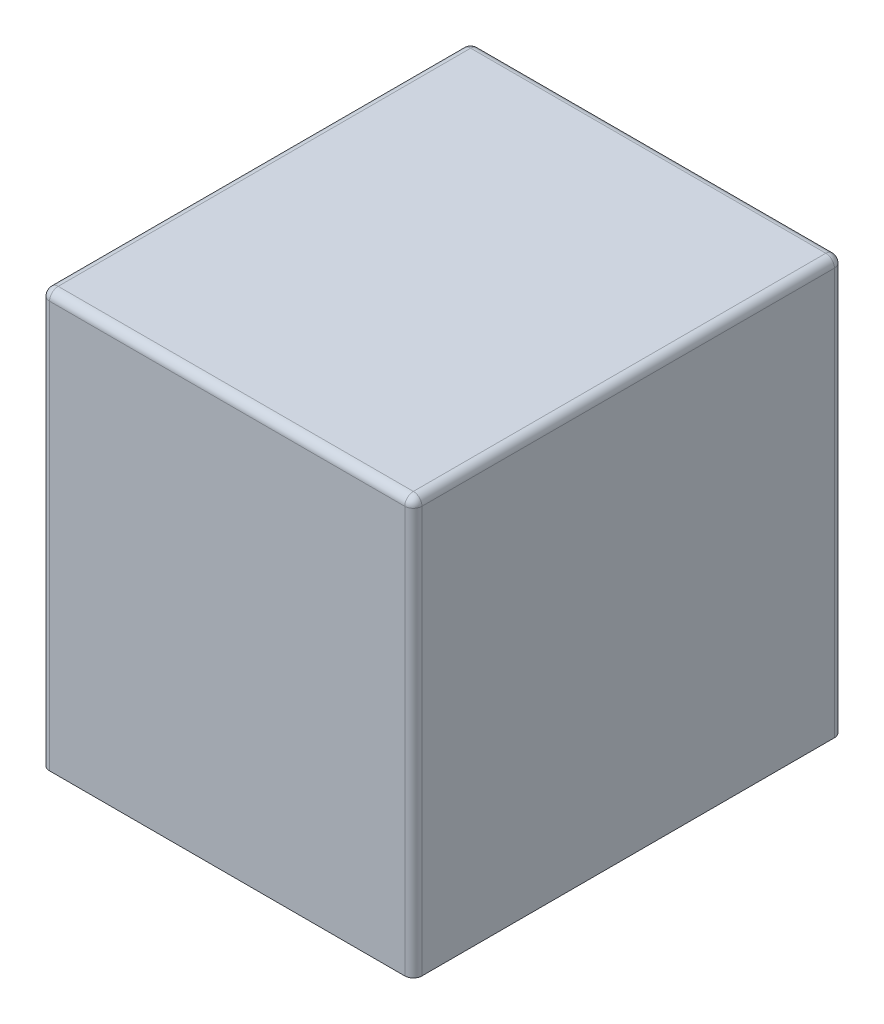
ISO-10303-21;
HEADER;
FILE_DESCRIPTION(('STEP AP214'),'2;1');
FILE_NAME('part.step','',(''),(''),'','','');
FILE_SCHEMA(('AUTOMOTIVE_DESIGN { 1 0 10303 214 1 1 1 1 }'));
ENDSEC;
DATA;
#1=APPLICATION_CONTEXT('core data for automotive mechanical design processes');
#2=APPLICATION_PROTOCOL_DEFINITION('international standard','automotive_design',2000,#1);
#3=PRODUCT_CONTEXT('',#1,'mechanical');
#4=PRODUCT('Part','Part','',(#3));
#5=PRODUCT_RELATED_PRODUCT_CATEGORY('part','',(#4));
#6=PRODUCT_DEFINITION_FORMATION('','',#4);
#7=PRODUCT_DEFINITION_CONTEXT('part definition',#1,'design');
#8=PRODUCT_DEFINITION('design','',#6,#7);
#9=PRODUCT_DEFINITION_SHAPE('','',#8);
#10=(LENGTH_UNIT() NAMED_UNIT(*) SI_UNIT(.MILLI.,.METRE.));
#11=(NAMED_UNIT(*) PLANE_ANGLE_UNIT() SI_UNIT($,.RADIAN.));
#12=(NAMED_UNIT(*) SI_UNIT($,.STERADIAN.) SOLID_ANGLE_UNIT());
#13=UNCERTAINTY_MEASURE_WITH_UNIT(LENGTH_MEASURE(1.E-05),#10,'distance_accuracy_value','');
#14=(GEOMETRIC_REPRESENTATION_CONTEXT(3) GLOBAL_UNCERTAINTY_ASSIGNED_CONTEXT((#13)) GLOBAL_UNIT_ASSIGNED_CONTEXT((#10,
#11,#12)) REPRESENTATION_CONTEXT('',''));
#15=CARTESIAN_POINT('',(0.,0.,0.));
#16=DIRECTION('',(0.,0.,1.));
#17=DIRECTION('',(1.,0.,0.));
#18=AXIS2_PLACEMENT_3D('',#15,#16,#17);
#19=CARTESIAN_POINT('',(0.,0.,0.));
#20=DIRECTION('',(0.,1.,0.));
#21=DIRECTION('',(0.,0.,1.));
#22=AXIS2_PLACEMENT_3D('',#19,#20,#21);
#23=PLANE('',#22);
#24=CARTESIAN_POINT('',(-62.5,0.,-72.5));
#25=DIRECTION('',(0.,-1.,0.));
#26=DIRECTION('',(0.,0.,-1.));
#27=AXIS2_PLACEMENT_3D('',#24,#25,#26);
#28=CIRCLE('',#27,1.45);
#29=CARTESIAN_POINT('',(-62.5,0.,-73.95));
#30=VERTEX_POINT('',#29);
#31=EDGE_CURVE('E248',#30,#30,#28,.T.);
#32=ORIENTED_EDGE('',*,*,#31,.F.);
#33=EDGE_LOOP('',(#32));
#34=FACE_BOUND('',#33,.T.);
#35=CARTESIAN_POINT('',(-62.5,0.,0.));
#36=DIRECTION('',(0.,-1.,0.));
#37=DIRECTION('',(0.,0.,-1.));
#38=AXIS2_PLACEMENT_3D('',#35,#36,#37);
#39=CIRCLE('',#38,1.45);
#40=CARTESIAN_POINT('',(-62.5,0.,-1.45000000000001));
#41=VERTEX_POINT('',#40);
#42=EDGE_CURVE('E256',#41,#41,#39,.T.);
#43=ORIENTED_EDGE('',*,*,#42,.F.);
#44=EDGE_LOOP('',(#43));
#45=FACE_BOUND('',#44,.T.);
#46=CARTESIAN_POINT('',(-62.5,0.,72.5));
#47=DIRECTION('',(0.,-1.,0.));
#48=DIRECTION('',(0.,0.,-1.));
#49=AXIS2_PLACEMENT_3D('',#46,#47,#48);
#50=CIRCLE('',#49,1.45);
#51=CARTESIAN_POINT('',(-62.5,0.,71.05));
#52=VERTEX_POINT('',#51);
#53=EDGE_CURVE('E718',#52,#52,#50,.T.);
#54=ORIENTED_EDGE('',*,*,#53,.F.);
#55=EDGE_LOOP('',(#54));
#56=FACE_BOUND('',#55,.T.);
#57=CARTESIAN_POINT('',(0.,0.,72.5));
#58=DIRECTION('',(0.,-1.,0.));
#59=DIRECTION('',(0.,0.,-1.));
#60=AXIS2_PLACEMENT_3D('',#57,#58,#59);
#61=CIRCLE('',#60,1.45);
#62=CARTESIAN_POINT('',(0.,0.,71.05));
#63=VERTEX_POINT('',#62);
#64=EDGE_CURVE('E727',#63,#63,#61,.T.);
#65=ORIENTED_EDGE('',*,*,#64,.F.);
#66=EDGE_LOOP('',(#65));
#67=FACE_BOUND('',#66,.T.);
#68=CARTESIAN_POINT('',(62.5,0.,72.5));
#69=DIRECTION('',(0.,-1.,0.));
#70=DIRECTION('',(0.,0.,-1.));
#71=AXIS2_PLACEMENT_3D('',#68,#69,#70);
#72=CIRCLE('',#71,1.45);
#73=CARTESIAN_POINT('',(62.5,0.,71.05));
#74=VERTEX_POINT('',#73);
#75=EDGE_CURVE('E733',#74,#74,#72,.T.);
#76=ORIENTED_EDGE('',*,*,#75,.F.);
#77=EDGE_LOOP('',(#76));
#78=FACE_BOUND('',#77,.T.);
#79=CARTESIAN_POINT('',(62.5,0.,0.));
#80=DIRECTION('',(0.,-1.,0.));
#81=DIRECTION('',(0.,0.,-1.));
#82=AXIS2_PLACEMENT_3D('',#79,#80,#81);
#83=CIRCLE('',#82,1.45);
#84=CARTESIAN_POINT('',(62.5,0.,-1.45000000000001));
#85=VERTEX_POINT('',#84);
#86=EDGE_CURVE('E739',#85,#85,#83,.T.);
#87=ORIENTED_EDGE('',*,*,#86,.F.);
#88=EDGE_LOOP('',(#87));
#89=FACE_BOUND('',#88,.T.);
#90=CARTESIAN_POINT('',(62.5,0.,-72.5));
#91=DIRECTION('',(0.,-1.,0.));
#92=DIRECTION('',(0.,0.,-1.));
#93=AXIS2_PLACEMENT_3D('',#90,#91,#92);
#94=CIRCLE('',#93,1.45);
#95=CARTESIAN_POINT('',(62.5,0.,-73.95));
#96=VERTEX_POINT('',#95);
#97=EDGE_CURVE('E745',#96,#96,#94,.T.);
#98=ORIENTED_EDGE('',*,*,#97,.F.);
#99=EDGE_LOOP('',(#98));
#100=FACE_BOUND('',#99,.T.);
#101=CARTESIAN_POINT('',(0.,0.,-72.5));
#102=DIRECTION('',(0.,-1.,0.));
#103=DIRECTION('',(0.,0.,-1.));
#104=AXIS2_PLACEMENT_3D('',#101,#102,#103);
#105=CIRCLE('',#104,1.45);
#106=CARTESIAN_POINT('',(0.,0.,-73.95));
#107=VERTEX_POINT('',#106);
#108=EDGE_CURVE('E264',#107,#107,#105,.T.);
#109=ORIENTED_EDGE('',*,*,#108,.F.);
#110=EDGE_LOOP('',(#109));
#111=FACE_BOUND('',#110,.T.);
#112=DIRECTION('',(0.,0.,1.));
#113=VECTOR('',#112,1.);
#114=CARTESIAN_POINT('',(-65.,0.,-75.));
#115=LINE('',#114,#113);
#116=CARTESIAN_POINT('',(-65.,0.,-72.));
#117=VERTEX_POINT('',#116);
#118=CARTESIAN_POINT('',(-65.,0.,72.));
#119=VERTEX_POINT('',#118);
#120=EDGE_CURVE('E162',#117,#119,#115,.T.);
#121=ORIENTED_EDGE('',*,*,#120,.F.);
#122=CARTESIAN_POINT('',(-62.,0.,-72.));
#123=DIRECTION('',(0.,1.,0.));
#124=DIRECTION('',(0.,0.,1.));
#125=AXIS2_PLACEMENT_3D('',#122,#123,#124);
#126=CIRCLE('',#125,3.);
#127=CARTESIAN_POINT('',(-62.,0.,-75.));
#128=VERTEX_POINT('',#127);
#129=EDGE_CURVE('E11',#117,#128,#126,.F.);
#130=ORIENTED_EDGE('',*,*,#129,.T.);
#131=DIRECTION('',(-1.,0.,0.));
#132=VECTOR('',#131,1.);
#133=CARTESIAN_POINT('',(-65.,0.,-75.));
#134=LINE('',#133,#132);
#135=CARTESIAN_POINT('',(62.,0.,-75.));
#136=VERTEX_POINT('',#135);
#137=EDGE_CURVE('E176',#136,#128,#134,.T.);
#138=ORIENTED_EDGE('',*,*,#137,.F.);
#139=CARTESIAN_POINT('',(62.,0.,-72.));
#140=DIRECTION('',(0.,1.,0.));
#141=DIRECTION('',(0.,0.,1.));
#142=AXIS2_PLACEMENT_3D('',#139,#140,#141);
#143=CIRCLE('',#142,3.);
#144=CARTESIAN_POINT('',(65.,0.,-72.));
#145=VERTEX_POINT('',#144);
#146=EDGE_CURVE('E210',#136,#145,#143,.F.);
#147=ORIENTED_EDGE('',*,*,#146,.T.);
#148=DIRECTION('',(0.,0.,-1.));
#149=VECTOR('',#148,1.);
#150=CARTESIAN_POINT('',(65.,0.,-75.));
#151=LINE('',#150,#149);
#152=CARTESIAN_POINT('',(65.,0.,72.));
#153=VERTEX_POINT('',#152);
#154=EDGE_CURVE('E173',#153,#145,#151,.T.);
#155=ORIENTED_EDGE('',*,*,#154,.F.);
#156=CARTESIAN_POINT('',(62.,0.,72.));
#157=DIRECTION('',(0.,1.,0.));
#158=DIRECTION('',(0.,0.,1.));
#159=AXIS2_PLACEMENT_3D('',#156,#157,#158);
#160=CIRCLE('',#159,3.);
#161=CARTESIAN_POINT('',(62.,0.,75.));
#162=VERTEX_POINT('',#161);
#163=EDGE_CURVE('E212',#153,#162,#160,.F.);
#164=ORIENTED_EDGE('',*,*,#163,.T.);
#165=DIRECTION('',(1.,0.,0.));
#166=VECTOR('',#165,1.);
#167=CARTESIAN_POINT('',(-65.,0.,75.));
#168=LINE('',#167,#166);
#169=CARTESIAN_POINT('',(-62.,0.,75.));
#170=VERTEX_POINT('',#169);
#171=EDGE_CURVE('E170',#170,#162,#168,.T.);
#172=ORIENTED_EDGE('',*,*,#171,.F.);
#173=CARTESIAN_POINT('',(-62.,0.,72.));
#174=DIRECTION('',(0.,1.,0.));
#175=DIRECTION('',(0.,0.,1.));
#176=AXIS2_PLACEMENT_3D('',#173,#174,#175);
#177=CIRCLE('',#176,3.);
#178=EDGE_CURVE('E44',#170,#119,#177,.F.);
#179=ORIENTED_EDGE('',*,*,#178,.T.);
#180=EDGE_LOOP('',(#121,#130,#138,#147,#155,#164,#172,#179));
#181=FACE_BOUND('',#180,.T.);
#182=DIRECTION('',(0.,0.,-1.));
#183=VECTOR('',#182,1.);
#184=CARTESIAN_POINT('',(60.,0.,-70.));
#185=LINE('',#184,#183);
#186=CARTESIAN_POINT('',(60.,0.,70.));
#187=VERTEX_POINT('',#186);
#188=CARTESIAN_POINT('',(60.,0.,-70.));
#189=VERTEX_POINT('',#188);
#190=EDGE_CURVE('E263',#187,#189,#185,.T.);
#191=ORIENTED_EDGE('',*,*,#190,.T.);
#192=DIRECTION('',(-1.,0.,0.));
#193=VECTOR('',#192,1.);
#194=CARTESIAN_POINT('',(-60.,0.,-70.));
#195=LINE('',#194,#193);
#196=CARTESIAN_POINT('',(-60.,0.,-70.));
#197=VERTEX_POINT('',#196);
#198=EDGE_CURVE('E273',#189,#197,#195,.T.);
#199=ORIENTED_EDGE('',*,*,#198,.T.);
#200=DIRECTION('',(0.,0.,1.));
#201=VECTOR('',#200,1.);
#202=CARTESIAN_POINT('',(-60.,0.,-70.));
#203=LINE('',#202,#201);
#204=CARTESIAN_POINT('',(-60.,0.,70.));
#205=VERTEX_POINT('',#204);
#206=EDGE_CURVE('E158',#197,#205,#203,.T.);
#207=ORIENTED_EDGE('',*,*,#206,.T.);
#208=DIRECTION('',(1.,0.,0.));
#209=VECTOR('',#208,1.);
#210=CARTESIAN_POINT('',(-60.,0.,70.));
#211=LINE('',#210,#209);
#212=EDGE_CURVE('E268',#205,#187,#211,.T.);
#213=ORIENTED_EDGE('',*,*,#212,.T.);
#214=EDGE_LOOP('',(#191,#199,#207,#213));
#215=FACE_BOUND('',#214,.T.);
#216=ADVANCED_FACE('F35',(#34,#45,#56,#67,#78,#89,#100,#111,#181,#215),#23,.F.);
#217=CARTESIAN_POINT('',(-65.,140.,-75.));
#218=DIRECTION('',(1.,0.,0.));
#219=DIRECTION('',(0.,0.,-1.));
#220=AXIS2_PLACEMENT_3D('',#217,#218,#219);
#221=PLANE('',#220);
#222=DIRECTION('',(0.,0.,1.));
#223=VECTOR('',#222,1.);
#224=CARTESIAN_POINT('',(-65.,142.,-75.));
#225=LINE('',#224,#223);
#226=CARTESIAN_POINT('',(-65.,142.,72.));
#227=VERTEX_POINT('',#226);
#228=CARTESIAN_POINT('',(-65.,142.,-72.));
#229=VERTEX_POINT('',#228);
#230=EDGE_CURVE('E202',#227,#229,#225,.F.);
#231=ORIENTED_EDGE('',*,*,#230,.T.);
#232=DIRECTION('',(0.,-1.,0.));
#233=VECTOR('',#232,1.);
#234=CARTESIAN_POINT('',(-65.,140.,-72.));
#235=LINE('',#234,#233);
#236=EDGE_CURVE('E204',#229,#117,#235,.T.);
#237=ORIENTED_EDGE('',*,*,#236,.T.);
#238=ORIENTED_EDGE('',*,*,#120,.T.);
#239=DIRECTION('',(0.,-1.,0.));
#240=VECTOR('',#239,1.);
#241=CARTESIAN_POINT('',(-65.,140.,72.));
#242=LINE('',#241,#240);
#243=EDGE_CURVE('E200',#119,#227,#242,.F.);
#244=ORIENTED_EDGE('',*,*,#243,.T.);
#245=EDGE_LOOP('',(#231,#237,#238,#244));
#246=FACE_BOUND('',#245,.T.);
#247=ADVANCED_FACE('F297',(#246),#221,.F.);
#248=CARTESIAN_POINT('',(-65.,140.,75.));
#249=DIRECTION('',(0.,0.,-1.));
#250=DIRECTION('',(-1.,0.,0.));
#251=AXIS2_PLACEMENT_3D('',#248,#249,#250);
#252=PLANE('',#251);
#253=DIRECTION('',(1.,0.,0.));
#254=VECTOR('',#253,1.);
#255=CARTESIAN_POINT('',(-65.,142.,75.));
#256=LINE('',#255,#254);
#257=CARTESIAN_POINT('',(62.,142.,75.));
#258=VERTEX_POINT('',#257);
#259=CARTESIAN_POINT('',(-62.,142.,75.));
#260=VERTEX_POINT('',#259);
#261=EDGE_CURVE('E196',#258,#260,#256,.F.);
#262=ORIENTED_EDGE('',*,*,#261,.T.);
#263=DIRECTION('',(0.,-1.,0.));
#264=VECTOR('',#263,1.);
#265=CARTESIAN_POINT('',(-62.,140.,75.));
#266=LINE('',#265,#264);
#267=EDGE_CURVE('E198',#260,#170,#266,.T.);
#268=ORIENTED_EDGE('',*,*,#267,.T.);
#269=ORIENTED_EDGE('',*,*,#171,.T.);
#270=DIRECTION('',(0.,-1.,0.));
#271=VECTOR('',#270,1.);
#272=CARTESIAN_POINT('',(62.,140.,75.));
#273=LINE('',#272,#271);
#274=EDGE_CURVE('E194',#162,#258,#273,.F.);
#275=ORIENTED_EDGE('',*,*,#274,.T.);
#276=EDGE_LOOP('',(#262,#268,#269,#275));
#277=FACE_BOUND('',#276,.T.);
#278=ADVANCED_FACE('F302',(#277),#252,.F.);
#279=CARTESIAN_POINT('',(65.,140.,-75.));
#280=DIRECTION('',(-1.,0.,0.));
#281=DIRECTION('',(0.,0.,1.));
#282=AXIS2_PLACEMENT_3D('',#279,#280,#281);
#283=PLANE('',#282);
#284=DIRECTION('',(0.,0.,-1.));
#285=VECTOR('',#284,1.);
#286=CARTESIAN_POINT('',(65.,142.,75.));
#287=LINE('',#286,#285);
#288=CARTESIAN_POINT('',(65.,142.,-72.));
#289=VERTEX_POINT('',#288);
#290=CARTESIAN_POINT('',(65.,142.,72.));
#291=VERTEX_POINT('',#290);
#292=EDGE_CURVE('E189',#289,#291,#287,.F.);
#293=ORIENTED_EDGE('',*,*,#292,.T.);
#294=DIRECTION('',(0.,-1.,0.));
#295=VECTOR('',#294,1.);
#296=CARTESIAN_POINT('',(65.,140.,72.));
#297=LINE('',#296,#295);
#298=EDGE_CURVE('E192',#291,#153,#297,.T.);
#299=ORIENTED_EDGE('',*,*,#298,.T.);
#300=ORIENTED_EDGE('',*,*,#154,.T.);
#301=DIRECTION('',(0.,-1.,0.));
#302=VECTOR('',#301,1.);
#303=CARTESIAN_POINT('',(65.,140.,-72.));
#304=LINE('',#303,#302);
#305=EDGE_CURVE('E187',#145,#289,#304,.F.);
#306=ORIENTED_EDGE('',*,*,#305,.T.);
#307=EDGE_LOOP('',(#293,#299,#300,#306));
#308=FACE_BOUND('',#307,.T.);
#309=ADVANCED_FACE('F293',(#308),#283,.F.);
#310=CARTESIAN_POINT('',(-65.,140.,-75.));
#311=DIRECTION('',(0.,0.,1.));
#312=DIRECTION('',(1.,0.,0.));
#313=AXIS2_PLACEMENT_3D('',#310,#311,#312);
#314=PLANE('',#313);
#315=ORIENTED_EDGE('',*,*,#137,.T.);
#316=DIRECTION('',(0.,-1.,0.));
#317=VECTOR('',#316,1.);
#318=CARTESIAN_POINT('',(-62.,140.,-75.));
#319=LINE('',#318,#317);
#320=CARTESIAN_POINT('',(-62.,142.,-75.));
#321=VERTEX_POINT('',#320);
#322=EDGE_CURVE('E52',#128,#321,#319,.F.);
#323=ORIENTED_EDGE('',*,*,#322,.T.);
#324=DIRECTION('',(-1.,0.,0.));
#325=VECTOR('',#324,1.);
#326=CARTESIAN_POINT('',(65.,142.,-75.));
#327=LINE('',#326,#325);
#328=CARTESIAN_POINT('',(62.,142.,-75.));
#329=VERTEX_POINT('',#328);
#330=EDGE_CURVE('E57',#321,#329,#327,.F.);
#331=ORIENTED_EDGE('',*,*,#330,.T.);
#332=DIRECTION('',(0.,-1.,0.));
#333=VECTOR('',#332,1.);
#334=CARTESIAN_POINT('',(62.,140.,-75.));
#335=LINE('',#334,#333);
#336=EDGE_CURVE('E206',#329,#136,#335,.T.);
#337=ORIENTED_EDGE('',*,*,#336,.T.);
#338=EDGE_LOOP('',(#315,#323,#331,#337));
#339=FACE_BOUND('',#338,.T.);
#340=ADVANCED_FACE('F286',(#339),#314,.F.);
#341=CARTESIAN_POINT('',(60.,140.,-70.));
#342=DIRECTION('',(-1.,0.,0.));
#343=DIRECTION('',(0.,0.,1.));
#344=AXIS2_PLACEMENT_3D('',#341,#342,#343);
#345=PLANE('',#344);
#346=ORIENTED_EDGE('',*,*,#190,.F.);
#347=DIRECTION('',(0.,-1.,0.));
#348=VECTOR('',#347,1.);
#349=CARTESIAN_POINT('',(60.,140.,70.));
#350=LINE('',#349,#348);
#351=CARTESIAN_POINT('',(60.,140.,70.));
#352=VERTEX_POINT('',#351);
#353=EDGE_CURVE('E164',#352,#187,#350,.T.);
#354=ORIENTED_EDGE('',*,*,#353,.F.);
#355=DIRECTION('',(0.,0.,-1.));
#356=VECTOR('',#355,1.);
#357=CARTESIAN_POINT('',(60.,140.,-70.));
#358=LINE('',#357,#356);
#359=CARTESIAN_POINT('',(60.,140.,-70.));
#360=VERTEX_POINT('',#359);
#361=EDGE_CURVE('E154',#352,#360,#358,.T.);
#362=ORIENTED_EDGE('',*,*,#361,.T.);
#363=DIRECTION('',(0.,-1.,0.));
#364=VECTOR('',#363,1.);
#365=CARTESIAN_POINT('',(60.,140.,-70.));
#366=LINE('',#365,#364);
#367=EDGE_CURVE('E153',#360,#189,#366,.T.);
#368=ORIENTED_EDGE('',*,*,#367,.T.);
#369=EDGE_LOOP('',(#346,#354,#362,#368));
#370=FACE_BOUND('',#369,.T.);
#371=ADVANCED_FACE('F284',(#370),#345,.T.);
#372=CARTESIAN_POINT('',(-60.,140.,-70.));
#373=DIRECTION('',(0.,0.,1.));
#374=DIRECTION('',(1.,0.,0.));
#375=AXIS2_PLACEMENT_3D('',#372,#373,#374);
#376=PLANE('',#375);
#377=ORIENTED_EDGE('',*,*,#198,.F.);
#378=ORIENTED_EDGE('',*,*,#367,.F.);
#379=DIRECTION('',(-1.,0.,0.));
#380=VECTOR('',#379,1.);
#381=CARTESIAN_POINT('',(-60.,140.,-70.));
#382=LINE('',#381,#380);
#383=CARTESIAN_POINT('',(-60.,140.,-70.));
#384=VERTEX_POINT('',#383);
#385=EDGE_CURVE('E139',#360,#384,#382,.T.);
#386=ORIENTED_EDGE('',*,*,#385,.T.);
#387=DIRECTION('',(0.,-1.,0.));
#388=VECTOR('',#387,1.);
#389=CARTESIAN_POINT('',(-60.,140.,-70.));
#390=LINE('',#389,#388);
#391=EDGE_CURVE('E150',#384,#197,#390,.T.);
#392=ORIENTED_EDGE('',*,*,#391,.T.);
#393=EDGE_LOOP('',(#377,#378,#386,#392));
#394=FACE_BOUND('',#393,.T.);
#395=ADVANCED_FACE('F149',(#394),#376,.T.);
#396=CARTESIAN_POINT('',(-60.,140.,-70.));
#397=DIRECTION('',(1.,0.,0.));
#398=DIRECTION('',(0.,0.,-1.));
#399=AXIS2_PLACEMENT_3D('',#396,#397,#398);
#400=PLANE('',#399);
#401=ORIENTED_EDGE('',*,*,#206,.F.);
#402=ORIENTED_EDGE('',*,*,#391,.F.);
#403=DIRECTION('',(0.,0.,1.));
#404=VECTOR('',#403,1.);
#405=CARTESIAN_POINT('',(-60.,140.,-70.));
#406=LINE('',#405,#404);
#407=CARTESIAN_POINT('',(-60.,140.,70.));
#408=VERTEX_POINT('',#407);
#409=EDGE_CURVE('E136',#384,#408,#406,.T.);
#410=ORIENTED_EDGE('',*,*,#409,.T.);
#411=DIRECTION('',(0.,-1.,0.));
#412=VECTOR('',#411,1.);
#413=CARTESIAN_POINT('',(-60.,140.,70.));
#414=LINE('',#413,#412);
#415=EDGE_CURVE('E160',#408,#205,#414,.T.);
#416=ORIENTED_EDGE('',*,*,#415,.T.);
#417=EDGE_LOOP('',(#401,#402,#410,#416));
#418=FACE_BOUND('',#417,.T.);
#419=ADVANCED_FACE('F156',(#418),#400,.T.);
#420=CARTESIAN_POINT('',(-60.,140.,70.));
#421=DIRECTION('',(0.,0.,-1.));
#422=DIRECTION('',(-1.,0.,0.));
#423=AXIS2_PLACEMENT_3D('',#420,#421,#422);
#424=PLANE('',#423);
#425=ORIENTED_EDGE('',*,*,#212,.F.);
#426=ORIENTED_EDGE('',*,*,#415,.F.);
#427=DIRECTION('',(1.,0.,0.));
#428=VECTOR('',#427,1.);
#429=CARTESIAN_POINT('',(-60.,140.,70.));
#430=LINE('',#429,#428);
#431=EDGE_CURVE('E142',#408,#352,#430,.T.);
#432=ORIENTED_EDGE('',*,*,#431,.T.);
#433=ORIENTED_EDGE('',*,*,#353,.T.);
#434=EDGE_LOOP('',(#425,#426,#432,#433));
#435=FACE_BOUND('',#434,.T.);
#436=ADVANCED_FACE('F281',(#435),#424,.T.);
#437=CARTESIAN_POINT('',(0.,140.,0.));
#438=DIRECTION('',(0.,1.,0.));
#439=DIRECTION('',(0.,0.,1.));
#440=AXIS2_PLACEMENT_3D('',#437,#438,#439);
#441=PLANE('',#440);
#442=ORIENTED_EDGE('',*,*,#385,.F.);
#443=ORIENTED_EDGE('',*,*,#361,.F.);
#444=ORIENTED_EDGE('',*,*,#431,.F.);
#445=ORIENTED_EDGE('',*,*,#409,.F.);
#446=EDGE_LOOP('',(#442,#443,#444,#445));
#447=FACE_BOUND('',#446,.T.);
#448=ADVANCED_FACE('F138',(#447),#441,.F.);
#449=CARTESIAN_POINT('',(0.,145.,0.));
#450=DIRECTION('',(0.,1.,0.));
#451=DIRECTION('',(0.,0.,1.));
#452=AXIS2_PLACEMENT_3D('',#449,#450,#451);
#453=PLANE('',#452);
#454=DIRECTION('',(1.,0.,0.));
#455=VECTOR('',#454,1.);
#456=CARTESIAN_POINT('',(65.,145.,72.));
#457=LINE('',#456,#455);
#458=CARTESIAN_POINT('',(-62.,145.,72.));
#459=VERTEX_POINT('',#458);
#460=CARTESIAN_POINT('',(62.,145.,72.));
#461=VERTEX_POINT('',#460);
#462=EDGE_CURVE('E182',#459,#461,#457,.T.);
#463=ORIENTED_EDGE('',*,*,#462,.T.);
#464=DIRECTION('',(0.,0.,-1.));
#465=VECTOR('',#464,1.);
#466=CARTESIAN_POINT('',(62.,145.,-75.));
#467=LINE('',#466,#465);
#468=CARTESIAN_POINT('',(62.,145.,-72.));
#469=VERTEX_POINT('',#468);
#470=EDGE_CURVE('E184',#461,#469,#467,.T.);
#471=ORIENTED_EDGE('',*,*,#470,.T.);
#472=DIRECTION('',(-1.,0.,0.));
#473=VECTOR('',#472,1.);
#474=CARTESIAN_POINT('',(-65.,145.,-72.));
#475=LINE('',#474,#473);
#476=CARTESIAN_POINT('',(-62.,145.,-72.));
#477=VERTEX_POINT('',#476);
#478=EDGE_CURVE('E178',#469,#477,#475,.T.);
#479=ORIENTED_EDGE('',*,*,#478,.T.);
#480=DIRECTION('',(0.,0.,1.));
#481=VECTOR('',#480,1.);
#482=CARTESIAN_POINT('',(-62.,145.,75.));
#483=LINE('',#482,#481);
#484=EDGE_CURVE('E180',#477,#459,#483,.T.);
#485=ORIENTED_EDGE('',*,*,#484,.T.);
#486=EDGE_LOOP('',(#463,#471,#479,#485));
#487=FACE_BOUND('',#486,.T.);
#488=ADVANCED_FACE('F384',(#487),#453,.T.);
#489=CARTESIAN_POINT('',(0.,12.,-72.5));
#490=DIRECTION('',(0.,-1.,0.));
#491=DIRECTION('',(0.,0.,-1.));
#492=AXIS2_PLACEMENT_3D('',#489,#490,#491);
#493=CYLINDRICAL_SURFACE('',#492,1.45);
#494=CARTESIAN_POINT('',(0.,12.,-72.5));
#495=DIRECTION('',(0.,-1.,0.));
#496=DIRECTION('',(0.,0.,-1.));
#497=AXIS2_PLACEMENT_3D('',#494,#495,#496);
#498=CIRCLE('',#497,1.45);
#499=CARTESIAN_POINT('',(0.,12.,-73.95));
#500=VERTEX_POINT('',#499);
#501=EDGE_CURVE('E260',#500,#500,#498,.T.);
#502=ORIENTED_EDGE('',*,*,#501,.F.);
#503=EDGE_LOOP('',(#502));
#504=FACE_BOUND('',#503,.T.);
#505=ORIENTED_EDGE('',*,*,#108,.T.);
#506=EDGE_LOOP('',(#505));
#507=FACE_BOUND('',#506,.T.);
#508=ADVANCED_FACE('F392',(#504,#507),#493,.F.);
#509=CARTESIAN_POINT('',(0.,12.,0.));
#510=DIRECTION('',(0.,-1.,0.));
#511=DIRECTION('',(0.,0.,-1.));
#512=AXIS2_PLACEMENT_3D('',#509,#510,#511);
#513=PLANE('',#512);
#514=ORIENTED_EDGE('',*,*,#501,.T.);
#515=EDGE_LOOP('',(#514));
#516=FACE_BOUND('',#515,.T.);
#517=ADVANCED_FACE('F398',(#516),#513,.T.);
#518=CARTESIAN_POINT('',(62.5,12.,-72.5));
#519=DIRECTION('',(0.,-1.,0.));
#520=DIRECTION('',(0.,0.,-1.));
#521=AXIS2_PLACEMENT_3D('',#518,#519,#520);
#522=CYLINDRICAL_SURFACE('',#521,1.45);
#523=CARTESIAN_POINT('',(62.5,12.,-72.5));
#524=DIRECTION('',(0.,-1.,0.));
#525=DIRECTION('',(0.,0.,-1.));
#526=AXIS2_PLACEMENT_3D('',#523,#524,#525);
#527=CIRCLE('',#526,1.45);
#528=CARTESIAN_POINT('',(62.5,12.,-73.95));
#529=VERTEX_POINT('',#528);
#530=EDGE_CURVE('E267',#529,#529,#527,.T.);
#531=ORIENTED_EDGE('',*,*,#530,.F.);
#532=EDGE_LOOP('',(#531));
#533=FACE_BOUND('',#532,.T.);
#534=ORIENTED_EDGE('',*,*,#97,.T.);
#535=EDGE_LOOP('',(#534));
#536=FACE_BOUND('',#535,.T.);
#537=ADVANCED_FACE('F437',(#533,#536),#522,.F.);
#538=CARTESIAN_POINT('',(0.,12.,0.));
#539=DIRECTION('',(0.,-1.,0.));
#540=DIRECTION('',(0.,0.,-1.));
#541=AXIS2_PLACEMENT_3D('',#538,#539,#540);
#542=PLANE('',#541);
#543=ORIENTED_EDGE('',*,*,#530,.T.);
#544=EDGE_LOOP('',(#543));
#545=FACE_BOUND('',#544,.T.);
#546=ADVANCED_FACE('F446',(#545),#542,.T.);
#547=CARTESIAN_POINT('',(62.5,12.,0.));
#548=DIRECTION('',(0.,-1.,0.));
#549=DIRECTION('',(0.,0.,-1.));
#550=AXIS2_PLACEMENT_3D('',#547,#548,#549);
#551=CYLINDRICAL_SURFACE('',#550,1.45);
#552=CARTESIAN_POINT('',(62.5,12.,0.));
#553=DIRECTION('',(0.,-1.,0.));
#554=DIRECTION('',(0.,0.,-1.));
#555=AXIS2_PLACEMENT_3D('',#552,#553,#554);
#556=CIRCLE('',#555,1.45);
#557=CARTESIAN_POINT('',(62.5,12.,-1.45000000000001));
#558=VERTEX_POINT('',#557);
#559=EDGE_CURVE('E742',#558,#558,#556,.T.);
#560=ORIENTED_EDGE('',*,*,#559,.F.);
#561=EDGE_LOOP('',(#560));
#562=FACE_BOUND('',#561,.T.);
#563=ORIENTED_EDGE('',*,*,#86,.T.);
#564=EDGE_LOOP('',(#563));
#565=FACE_BOUND('',#564,.T.);
#566=ADVANCED_FACE('F457',(#562,#565),#551,.F.);
#567=CARTESIAN_POINT('',(0.,12.,0.));
#568=DIRECTION('',(0.,-1.,0.));
#569=DIRECTION('',(0.,0.,-1.));
#570=AXIS2_PLACEMENT_3D('',#567,#568,#569);
#571=PLANE('',#570);
#572=ORIENTED_EDGE('',*,*,#559,.T.);
#573=EDGE_LOOP('',(#572));
#574=FACE_BOUND('',#573,.T.);
#575=ADVANCED_FACE('F467',(#574),#571,.T.);
#576=CARTESIAN_POINT('',(62.5,12.,72.5));
#577=DIRECTION('',(0.,-1.,0.));
#578=DIRECTION('',(0.,0.,-1.));
#579=AXIS2_PLACEMENT_3D('',#576,#577,#578);
#580=CYLINDRICAL_SURFACE('',#579,1.45);
#581=CARTESIAN_POINT('',(62.5,12.,72.5));
#582=DIRECTION('',(0.,-1.,0.));
#583=DIRECTION('',(0.,0.,-1.));
#584=AXIS2_PLACEMENT_3D('',#581,#582,#583);
#585=CIRCLE('',#584,1.45);
#586=CARTESIAN_POINT('',(62.5,12.,71.05));
#587=VERTEX_POINT('',#586);
#588=EDGE_CURVE('E736',#587,#587,#585,.T.);
#589=ORIENTED_EDGE('',*,*,#588,.F.);
#590=EDGE_LOOP('',(#589));
#591=FACE_BOUND('',#590,.T.);
#592=ORIENTED_EDGE('',*,*,#75,.T.);
#593=EDGE_LOOP('',(#592));
#594=FACE_BOUND('',#593,.T.);
#595=ADVANCED_FACE('F478',(#591,#594),#580,.F.);
#596=CARTESIAN_POINT('',(0.,12.,0.));
#597=DIRECTION('',(0.,-1.,0.));
#598=DIRECTION('',(0.,0.,-1.));
#599=AXIS2_PLACEMENT_3D('',#596,#597,#598);
#600=PLANE('',#599);
#601=ORIENTED_EDGE('',*,*,#588,.T.);
#602=EDGE_LOOP('',(#601));
#603=FACE_BOUND('',#602,.T.);
#604=ADVANCED_FACE('F488',(#603),#600,.T.);
#605=CARTESIAN_POINT('',(0.,12.,72.5));
#606=DIRECTION('',(0.,-1.,0.));
#607=DIRECTION('',(0.,0.,-1.));
#608=AXIS2_PLACEMENT_3D('',#605,#606,#607);
#609=CYLINDRICAL_SURFACE('',#608,1.45);
#610=CARTESIAN_POINT('',(0.,12.,72.5));
#611=DIRECTION('',(0.,-1.,0.));
#612=DIRECTION('',(0.,0.,-1.));
#613=AXIS2_PLACEMENT_3D('',#610,#611,#612);
#614=CIRCLE('',#613,1.45);
#615=CARTESIAN_POINT('',(0.,12.,71.05));
#616=VERTEX_POINT('',#615);
#617=EDGE_CURVE('E730',#616,#616,#614,.T.);
#618=ORIENTED_EDGE('',*,*,#617,.F.);
#619=EDGE_LOOP('',(#618));
#620=FACE_BOUND('',#619,.T.);
#621=ORIENTED_EDGE('',*,*,#64,.T.);
#622=EDGE_LOOP('',(#621));
#623=FACE_BOUND('',#622,.T.);
#624=ADVANCED_FACE('F499',(#620,#623),#609,.F.);
#625=CARTESIAN_POINT('',(0.,12.,0.));
#626=DIRECTION('',(0.,-1.,0.));
#627=DIRECTION('',(0.,0.,-1.));
#628=AXIS2_PLACEMENT_3D('',#625,#626,#627);
#629=PLANE('',#628);
#630=ORIENTED_EDGE('',*,*,#617,.T.);
#631=EDGE_LOOP('',(#630));
#632=FACE_BOUND('',#631,.T.);
#633=ADVANCED_FACE('F509',(#632),#629,.T.);
#634=CARTESIAN_POINT('',(-62.5,12.,72.5));
#635=DIRECTION('',(0.,-1.,0.));
#636=DIRECTION('',(0.,0.,-1.));
#637=AXIS2_PLACEMENT_3D('',#634,#635,#636);
#638=CYLINDRICAL_SURFACE('',#637,1.45);
#639=CARTESIAN_POINT('',(-62.5,12.,72.5));
#640=DIRECTION('',(0.,-1.,0.));
#641=DIRECTION('',(0.,0.,-1.));
#642=AXIS2_PLACEMENT_3D('',#639,#640,#641);
#643=CIRCLE('',#642,1.45);
#644=CARTESIAN_POINT('',(-62.5,12.,71.05));
#645=VERTEX_POINT('',#644);
#646=EDGE_CURVE('E721',#645,#645,#643,.T.);
#647=ORIENTED_EDGE('',*,*,#646,.F.);
#648=EDGE_LOOP('',(#647));
#649=FACE_BOUND('',#648,.T.);
#650=ORIENTED_EDGE('',*,*,#53,.T.);
#651=EDGE_LOOP('',(#650));
#652=FACE_BOUND('',#651,.T.);
#653=ADVANCED_FACE('F520',(#649,#652),#638,.F.);
#654=CARTESIAN_POINT('',(0.,12.,0.));
#655=DIRECTION('',(0.,-1.,0.));
#656=DIRECTION('',(0.,0.,-1.));
#657=AXIS2_PLACEMENT_3D('',#654,#655,#656);
#658=PLANE('',#657);
#659=ORIENTED_EDGE('',*,*,#646,.T.);
#660=EDGE_LOOP('',(#659));
#661=FACE_BOUND('',#660,.T.);
#662=ADVANCED_FACE('F530',(#661),#658,.T.);
#663=CARTESIAN_POINT('',(-62.5,12.,0.));
#664=DIRECTION('',(0.,-1.,0.));
#665=DIRECTION('',(0.,0.,-1.));
#666=AXIS2_PLACEMENT_3D('',#663,#664,#665);
#667=CYLINDRICAL_SURFACE('',#666,1.45);
#668=CARTESIAN_POINT('',(-62.5,12.,0.));
#669=DIRECTION('',(0.,-1.,0.));
#670=DIRECTION('',(0.,0.,-1.));
#671=AXIS2_PLACEMENT_3D('',#668,#669,#670);
#672=CIRCLE('',#671,1.45);
#673=CARTESIAN_POINT('',(-62.5,12.,-1.45000000000001));
#674=VERTEX_POINT('',#673);
#675=EDGE_CURVE('E717',#674,#674,#672,.T.);
#676=ORIENTED_EDGE('',*,*,#675,.F.);
#677=EDGE_LOOP('',(#676));
#678=FACE_BOUND('',#677,.T.);
#679=ORIENTED_EDGE('',*,*,#42,.T.);
#680=EDGE_LOOP('',(#679));
#681=FACE_BOUND('',#680,.T.);
#682=ADVANCED_FACE('F541',(#678,#681),#667,.F.);
#683=CARTESIAN_POINT('',(0.,12.,0.));
#684=DIRECTION('',(0.,-1.,0.));
#685=DIRECTION('',(0.,0.,-1.));
#686=AXIS2_PLACEMENT_3D('',#683,#684,#685);
#687=PLANE('',#686);
#688=ORIENTED_EDGE('',*,*,#675,.T.);
#689=EDGE_LOOP('',(#688));
#690=FACE_BOUND('',#689,.T.);
#691=ADVANCED_FACE('F551',(#690),#687,.T.);
#692=CARTESIAN_POINT('',(-62.5,12.,-72.5));
#693=DIRECTION('',(0.,-1.,0.));
#694=DIRECTION('',(0.,0.,-1.));
#695=AXIS2_PLACEMENT_3D('',#692,#693,#694);
#696=CYLINDRICAL_SURFACE('',#695,1.45);
#697=CARTESIAN_POINT('',(-62.5,12.,-72.5));
#698=DIRECTION('',(0.,-1.,0.));
#699=DIRECTION('',(0.,0.,-1.));
#700=AXIS2_PLACEMENT_3D('',#697,#698,#699);
#701=CIRCLE('',#700,1.45);
#702=CARTESIAN_POINT('',(-62.5,12.,-73.95));
#703=VERTEX_POINT('',#702);
#704=EDGE_CURVE('E251',#703,#703,#701,.T.);
#705=ORIENTED_EDGE('',*,*,#704,.F.);
#706=EDGE_LOOP('',(#705));
#707=FACE_BOUND('',#706,.T.);
#708=ORIENTED_EDGE('',*,*,#31,.T.);
#709=EDGE_LOOP('',(#708));
#710=FACE_BOUND('',#709,.T.);
#711=ADVANCED_FACE('F562',(#707,#710),#696,.F.);
#712=CARTESIAN_POINT('',(0.,12.,0.));
#713=DIRECTION('',(0.,-1.,0.));
#714=DIRECTION('',(0.,0.,-1.));
#715=AXIS2_PLACEMENT_3D('',#712,#713,#714);
#716=PLANE('',#715);
#717=ORIENTED_EDGE('',*,*,#704,.T.);
#718=EDGE_LOOP('',(#717));
#719=FACE_BOUND('',#718,.T.);
#720=ADVANCED_FACE('F357',(#719),#716,.T.);
#721=CARTESIAN_POINT('',(-62.,140.,72.));
#722=DIRECTION('',(0.,-1.,0.));
#723=DIRECTION('',(0.,0.,-1.));
#724=AXIS2_PLACEMENT_3D('',#721,#722,#723);
#725=CYLINDRICAL_SURFACE('',#724,3.);
#726=ORIENTED_EDGE('',*,*,#178,.F.);
#727=ORIENTED_EDGE('',*,*,#267,.F.);
#728=CARTESIAN_POINT('',(-62.,142.,72.));
#729=DIRECTION('',(0.,1.,0.));
#730=DIRECTION('',(0.,0.,1.));
#731=AXIS2_PLACEMENT_3D('',#728,#729,#730);
#732=CIRCLE('',#731,3.);
#733=EDGE_CURVE('E39',#227,#260,#732,.T.);
#734=ORIENTED_EDGE('',*,*,#733,.F.);
#735=ORIENTED_EDGE('',*,*,#243,.F.);
#736=EDGE_LOOP('',(#726,#727,#734,#735));
#737=FACE_BOUND('',#736,.T.);
#738=ADVANCED_FACE('F37',(#737),#725,.T.);
#739=CARTESIAN_POINT('',(-62.,142.,0.));
#740=DIRECTION('',(0.,0.,-1.));
#741=DIRECTION('',(-1.,0.,0.));
#742=AXIS2_PLACEMENT_3D('',#739,#740,#741);
#743=CYLINDRICAL_SURFACE('',#742,3.);
#744=CARTESIAN_POINT('',(-62.,142.,-72.));
#745=DIRECTION('',(0.,0.,-1.));
#746=DIRECTION('',(-1.,0.,0.));
#747=AXIS2_PLACEMENT_3D('',#744,#745,#746);
#748=CIRCLE('',#747,3.);
#749=EDGE_CURVE('E240',#229,#477,#748,.T.);
#750=ORIENTED_EDGE('',*,*,#749,.F.);
#751=ORIENTED_EDGE('',*,*,#230,.F.);
#752=CARTESIAN_POINT('',(-62.,142.,72.));
#753=DIRECTION('',(0.,0.,1.));
#754=DIRECTION('',(1.,0.,0.));
#755=AXIS2_PLACEMENT_3D('',#752,#753,#754);
#756=CIRCLE('',#755,3.);
#757=EDGE_CURVE('E242',#459,#227,#756,.T.);
#758=ORIENTED_EDGE('',*,*,#757,.F.);
#759=ORIENTED_EDGE('',*,*,#484,.F.);
#760=EDGE_LOOP('',(#750,#751,#758,#759));
#761=FACE_BOUND('',#760,.T.);
#762=ADVANCED_FACE('F350',(#761),#743,.T.);
#763=CARTESIAN_POINT('',(-62.,140.,-72.));
#764=DIRECTION('',(0.,-1.,0.));
#765=DIRECTION('',(0.,0.,-1.));
#766=AXIS2_PLACEMENT_3D('',#763,#764,#765);
#767=CYLINDRICAL_SURFACE('',#766,3.);
#768=ORIENTED_EDGE('',*,*,#129,.F.);
#769=ORIENTED_EDGE('',*,*,#236,.F.);
#770=CARTESIAN_POINT('',(-62.,142.,-72.));
#771=DIRECTION('',(0.,1.,0.));
#772=DIRECTION('',(0.,0.,1.));
#773=AXIS2_PLACEMENT_3D('',#770,#771,#772);
#774=CIRCLE('',#773,3.);
#775=EDGE_CURVE('E237',#321,#229,#774,.T.);
#776=ORIENTED_EDGE('',*,*,#775,.F.);
#777=ORIENTED_EDGE('',*,*,#322,.F.);
#778=EDGE_LOOP('',(#768,#769,#776,#777));
#779=FACE_BOUND('',#778,.T.);
#780=ADVANCED_FACE('F348',(#779),#767,.T.);
#781=CARTESIAN_POINT('',(-62.,142.,72.));
#782=DIRECTION('',(-1.,0.,0.));
#783=DIRECTION('',(0.,0.,1.));
#784=AXIS2_PLACEMENT_3D('',#781,#782,#783);
#785=SPHERICAL_SURFACE('',#784,3.);
#786=ORIENTED_EDGE('',*,*,#757,.T.);
#787=ORIENTED_EDGE('',*,*,#733,.T.);
#788=CARTESIAN_POINT('',(-62.,142.,72.));
#789=DIRECTION('',(-1.,0.,0.));
#790=DIRECTION('',(0.,0.,1.));
#791=AXIS2_PLACEMENT_3D('',#788,#789,#790);
#792=CIRCLE('',#791,3.);
#793=EDGE_CURVE('E234',#459,#260,#792,.F.);
#794=ORIENTED_EDGE('',*,*,#793,.F.);
#795=EDGE_LOOP('',(#786,#787,#794));
#796=FACE_BOUND('',#795,.T.);
#797=ADVANCED_FACE('F344',(#796),#785,.T.);
#798=CARTESIAN_POINT('',(-62.,142.,-72.));
#799=DIRECTION('',(-1.,0.,0.));
#800=DIRECTION('',(0.,0.,1.));
#801=AXIS2_PLACEMENT_3D('',#798,#799,#800);
#802=SPHERICAL_SURFACE('',#801,3.);
#803=ORIENTED_EDGE('',*,*,#775,.T.);
#804=ORIENTED_EDGE('',*,*,#749,.T.);
#805=CARTESIAN_POINT('',(-62.,142.,-72.));
#806=DIRECTION('',(-1.,0.,0.));
#807=DIRECTION('',(0.,0.,1.));
#808=AXIS2_PLACEMENT_3D('',#805,#806,#807);
#809=CIRCLE('',#808,3.);
#810=EDGE_CURVE('E231',#321,#477,#809,.F.);
#811=ORIENTED_EDGE('',*,*,#810,.F.);
#812=EDGE_LOOP('',(#803,#804,#811));
#813=FACE_BOUND('',#812,.T.);
#814=ADVANCED_FACE('F340',(#813),#802,.T.);
#815=CARTESIAN_POINT('',(62.,140.,72.));
#816=DIRECTION('',(0.,-1.,0.));
#817=DIRECTION('',(0.,0.,-1.));
#818=AXIS2_PLACEMENT_3D('',#815,#816,#817);
#819=CYLINDRICAL_SURFACE('',#818,3.);
#820=ORIENTED_EDGE('',*,*,#163,.F.);
#821=ORIENTED_EDGE('',*,*,#298,.F.);
#822=CARTESIAN_POINT('',(62.,142.,72.));
#823=DIRECTION('',(0.,1.,0.));
#824=DIRECTION('',(0.,0.,1.));
#825=AXIS2_PLACEMENT_3D('',#822,#823,#824);
#826=CIRCLE('',#825,3.);
#827=EDGE_CURVE('E228',#258,#291,#826,.T.);
#828=ORIENTED_EDGE('',*,*,#827,.F.);
#829=ORIENTED_EDGE('',*,*,#274,.F.);
#830=EDGE_LOOP('',(#820,#821,#828,#829));
#831=FACE_BOUND('',#830,.T.);
#832=ADVANCED_FACE('F336',(#831),#819,.T.);
#833=CARTESIAN_POINT('',(0.,142.,72.));
#834=DIRECTION('',(-1.,0.,0.));
#835=DIRECTION('',(0.,0.,1.));
#836=AXIS2_PLACEMENT_3D('',#833,#834,#835);
#837=CYLINDRICAL_SURFACE('',#836,3.);
#838=ORIENTED_EDGE('',*,*,#793,.T.);
#839=ORIENTED_EDGE('',*,*,#261,.F.);
#840=CARTESIAN_POINT('',(62.,142.,72.));
#841=DIRECTION('',(1.,0.,0.));
#842=DIRECTION('',(0.,0.,-1.));
#843=AXIS2_PLACEMENT_3D('',#840,#841,#842);
#844=CIRCLE('',#843,3.);
#845=EDGE_CURVE('E225',#461,#258,#844,.T.);
#846=ORIENTED_EDGE('',*,*,#845,.F.);
#847=ORIENTED_EDGE('',*,*,#462,.F.);
#848=EDGE_LOOP('',(#838,#839,#846,#847));
#849=FACE_BOUND('',#848,.T.);
#850=ADVANCED_FACE('F332',(#849),#837,.T.);
#851=CARTESIAN_POINT('',(0.,142.,-72.));
#852=DIRECTION('',(1.,0.,0.));
#853=DIRECTION('',(0.,0.,-1.));
#854=AXIS2_PLACEMENT_3D('',#851,#852,#853);
#855=CYLINDRICAL_SURFACE('',#854,3.);
#856=ORIENTED_EDGE('',*,*,#810,.T.);
#857=ORIENTED_EDGE('',*,*,#478,.F.);
#858=CARTESIAN_POINT('',(62.,142.,-72.));
#859=DIRECTION('',(1.,0.,0.));
#860=DIRECTION('',(0.,1.,0.));
#861=AXIS2_PLACEMENT_3D('',#858,#859,#860);
#862=CIRCLE('',#861,3.);
#863=EDGE_CURVE('E222',#329,#469,#862,.T.);
#864=ORIENTED_EDGE('',*,*,#863,.F.);
#865=ORIENTED_EDGE('',*,*,#330,.F.);
#866=EDGE_LOOP('',(#856,#857,#864,#865));
#867=FACE_BOUND('',#866,.T.);
#868=ADVANCED_FACE('F328',(#867),#855,.T.);
#869=CARTESIAN_POINT('',(62.,140.,-72.));
#870=DIRECTION('',(0.,-1.,0.));
#871=DIRECTION('',(0.,0.,-1.));
#872=AXIS2_PLACEMENT_3D('',#869,#870,#871);
#873=CYLINDRICAL_SURFACE('',#872,3.);
#874=ORIENTED_EDGE('',*,*,#146,.F.);
#875=ORIENTED_EDGE('',*,*,#336,.F.);
#876=CARTESIAN_POINT('',(62.,142.,-72.));
#877=DIRECTION('',(0.,1.,0.));
#878=DIRECTION('',(0.,0.,1.));
#879=AXIS2_PLACEMENT_3D('',#876,#877,#878);
#880=CIRCLE('',#879,3.);
#881=EDGE_CURVE('E219',#289,#329,#880,.T.);
#882=ORIENTED_EDGE('',*,*,#881,.F.);
#883=ORIENTED_EDGE('',*,*,#305,.F.);
#884=EDGE_LOOP('',(#874,#875,#882,#883));
#885=FACE_BOUND('',#884,.T.);
#886=ADVANCED_FACE('F324',(#885),#873,.T.);
#887=CARTESIAN_POINT('',(62.,142.,72.));
#888=DIRECTION('',(0.,0.,1.));
#889=DIRECTION('',(1.,0.,0.));
#890=AXIS2_PLACEMENT_3D('',#887,#888,#889);
#891=SPHERICAL_SURFACE('',#890,3.);
#892=ORIENTED_EDGE('',*,*,#845,.T.);
#893=ORIENTED_EDGE('',*,*,#827,.T.);
#894=CARTESIAN_POINT('',(62.,142.,72.));
#895=DIRECTION('',(0.,0.,1.));
#896=DIRECTION('',(1.,0.,0.));
#897=AXIS2_PLACEMENT_3D('',#894,#895,#896);
#898=CIRCLE('',#897,3.);
#899=EDGE_CURVE('E217',#461,#291,#898,.F.);
#900=ORIENTED_EDGE('',*,*,#899,.F.);
#901=EDGE_LOOP('',(#892,#893,#900));
#902=FACE_BOUND('',#901,.T.);
#903=ADVANCED_FACE('F320',(#902),#891,.T.);
#904=CARTESIAN_POINT('',(62.,142.,-72.));
#905=DIRECTION('',(0.,0.,-1.));
#906=DIRECTION('',(-1.,0.,0.));
#907=AXIS2_PLACEMENT_3D('',#904,#905,#906);
#908=SPHERICAL_SURFACE('',#907,3.);
#909=ORIENTED_EDGE('',*,*,#881,.T.);
#910=ORIENTED_EDGE('',*,*,#863,.T.);
#911=CARTESIAN_POINT('',(62.,142.,-72.));
#912=DIRECTION('',(0.,0.,-1.));
#913=DIRECTION('',(-1.,0.,0.));
#914=AXIS2_PLACEMENT_3D('',#911,#912,#913);
#915=CIRCLE('',#914,3.);
#916=EDGE_CURVE('E215',#289,#469,#915,.F.);
#917=ORIENTED_EDGE('',*,*,#916,.F.);
#918=EDGE_LOOP('',(#909,#910,#917));
#919=FACE_BOUND('',#918,.T.);
#920=ADVANCED_FACE('F316',(#919),#908,.T.);
#921=CARTESIAN_POINT('',(62.,142.,0.));
#922=DIRECTION('',(0.,0.,1.));
#923=DIRECTION('',(1.,0.,0.));
#924=AXIS2_PLACEMENT_3D('',#921,#922,#923);
#925=CYLINDRICAL_SURFACE('',#924,3.);
#926=ORIENTED_EDGE('',*,*,#899,.T.);
#927=ORIENTED_EDGE('',*,*,#292,.F.);
#928=ORIENTED_EDGE('',*,*,#916,.T.);
#929=ORIENTED_EDGE('',*,*,#470,.F.);
#930=EDGE_LOOP('',(#926,#927,#928,#929));
#931=FACE_BOUND('',#930,.T.);
#932=ADVANCED_FACE('F313',(#931),#925,.T.);
#933=CLOSED_SHELL('',(#216,#247,#278,#309,#340,#371,#395,#419,#436,#448,#488,#508,#517,#537,
#546,#566,#575,#595,#604,#624,#633,#653,#662,#682,#691,#711,#720,#738,#762,#780,#797,#814,#832,
#850,#868,#886,#903,#920,#932));
#934=MANIFOLD_SOLID_BREP('B2',#933);
#935=ADVANCED_BREP_SHAPE_REPRESENTATION('',(#18,#934),#14);
#936=SHAPE_DEFINITION_REPRESENTATION(#9,#935);
ENDSEC;
END-ISO-10303-21;
